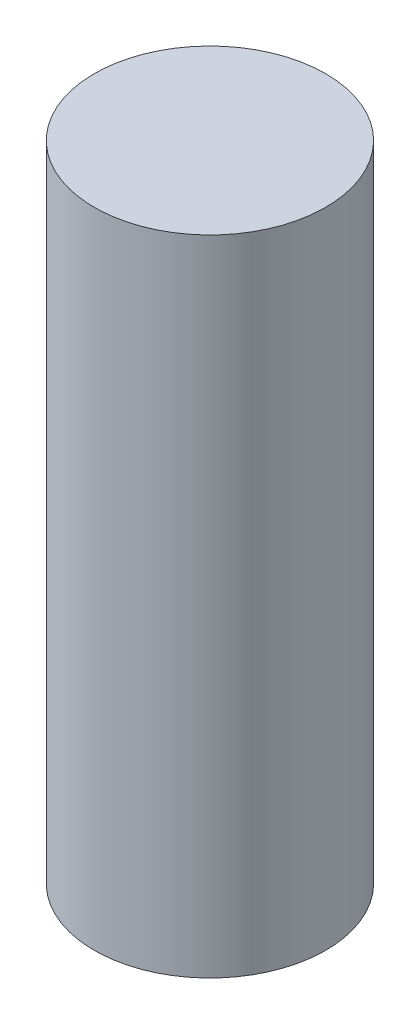
ISO-10303-21;
HEADER;
FILE_DESCRIPTION(('STEP AP214'),'2;1');
FILE_NAME('part.step','',(''),(''),'','','');
FILE_SCHEMA(('AUTOMOTIVE_DESIGN { 1 0 10303 214 1 1 1 1 }'));
ENDSEC;
DATA;
#1=APPLICATION_CONTEXT('core data for automotive mechanical design processes');
#2=APPLICATION_PROTOCOL_DEFINITION('international standard','automotive_design',2000,#1);
#3=PRODUCT_CONTEXT('',#1,'mechanical');
#4=PRODUCT('Part','Part','',(#3));
#5=PRODUCT_RELATED_PRODUCT_CATEGORY('part','',(#4));
#6=PRODUCT_DEFINITION_FORMATION('','',#4);
#7=PRODUCT_DEFINITION_CONTEXT('part definition',#1,'design');
#8=PRODUCT_DEFINITION('design','',#6,#7);
#9=PRODUCT_DEFINITION_SHAPE('','',#8);
#10=(LENGTH_UNIT() NAMED_UNIT(*) SI_UNIT(.MILLI.,.METRE.));
#11=(NAMED_UNIT(*) PLANE_ANGLE_UNIT() SI_UNIT($,.RADIAN.));
#12=(NAMED_UNIT(*) SI_UNIT($,.STERADIAN.) SOLID_ANGLE_UNIT());
#13=UNCERTAINTY_MEASURE_WITH_UNIT(LENGTH_MEASURE(1.E-05),#10,'distance_accuracy_value','');
#14=(GEOMETRIC_REPRESENTATION_CONTEXT(3) GLOBAL_UNCERTAINTY_ASSIGNED_CONTEXT((#13)) GLOBAL_UNIT_ASSIGNED_CONTEXT((#10,
#11,#12)) REPRESENTATION_CONTEXT('',''));
#15=CARTESIAN_POINT('',(0.,0.,0.));
#16=DIRECTION('',(0.,0.,1.));
#17=DIRECTION('',(1.,0.,0.));
#18=AXIS2_PLACEMENT_3D('',#15,#16,#17);
#19=CARTESIAN_POINT('',(0.,22.239986,0.));
#20=DIRECTION('',(0.,-1.,0.));
#21=DIRECTION('',(0.,0.,1.));
#22=AXIS2_PLACEMENT_3D('',#19,#20,#21);
#23=CYLINDRICAL_SURFACE('',#22,4.);
#24=CARTESIAN_POINT('',(0.,22.239986,0.));
#25=DIRECTION('',(0.,-1.,0.));
#26=DIRECTION('',(0.,0.,-1.));
#27=AXIS2_PLACEMENT_3D('',#24,#25,#26);
#28=CIRCLE('',#27,4.);
#29=CARTESIAN_POINT('',(0.,22.239986,-4.));
#30=VERTEX_POINT('',#29);
#31=EDGE_CURVE('E10',#30,#30,#28,.T.);
#32=ORIENTED_EDGE('',*,*,#31,.T.);
#33=EDGE_LOOP('',(#32));
#34=FACE_BOUND('',#33,.T.);
#35=CARTESIAN_POINT('',(0.,0.,0.));
#36=DIRECTION('',(0.,-1.,0.));
#37=DIRECTION('',(0.,0.,-1.));
#38=AXIS2_PLACEMENT_3D('',#35,#36,#37);
#39=CIRCLE('',#38,4.);
#40=CARTESIAN_POINT('',(0.,0.,-4.));
#41=VERTEX_POINT('',#40);
#42=EDGE_CURVE('E42',#41,#41,#39,.T.);
#43=ORIENTED_EDGE('',*,*,#42,.F.);
#44=EDGE_LOOP('',(#43));
#45=FACE_BOUND('',#44,.T.);
#46=ADVANCED_FACE('F39',(#34,#45),#23,.T.);
#47=CARTESIAN_POINT('',(0.,22.239986,0.));
#48=DIRECTION('',(0.,1.,0.));
#49=DIRECTION('',(0.,0.,-1.));
#50=AXIS2_PLACEMENT_3D('',#47,#48,#49);
#51=PLANE('',#50);
#52=ORIENTED_EDGE('',*,*,#31,.F.);
#53=EDGE_LOOP('',(#52));
#54=FACE_BOUND('',#53,.T.);
#55=ADVANCED_FACE('F54',(#54),#51,.T.);
#56=CARTESIAN_POINT('',(0.,0.,0.));
#57=DIRECTION('',(0.,1.,0.));
#58=DIRECTION('',(0.,0.,-1.));
#59=AXIS2_PLACEMENT_3D('',#56,#57,#58);
#60=PLANE('',#59);
#61=ORIENTED_EDGE('',*,*,#42,.T.);
#62=EDGE_LOOP('',(#61));
#63=FACE_BOUND('',#62,.T.);
#64=ADVANCED_FACE('F51',(#63),#60,.F.);
#65=CLOSED_SHELL('',(#46,#55,#64));
#66=MANIFOLD_SOLID_BREP('B2',#65);
#67=ADVANCED_BREP_SHAPE_REPRESENTATION('',(#18,#66),#14);
#68=SHAPE_DEFINITION_REPRESENTATION(#9,#67);
ENDSEC;
END-ISO-10303-21;
